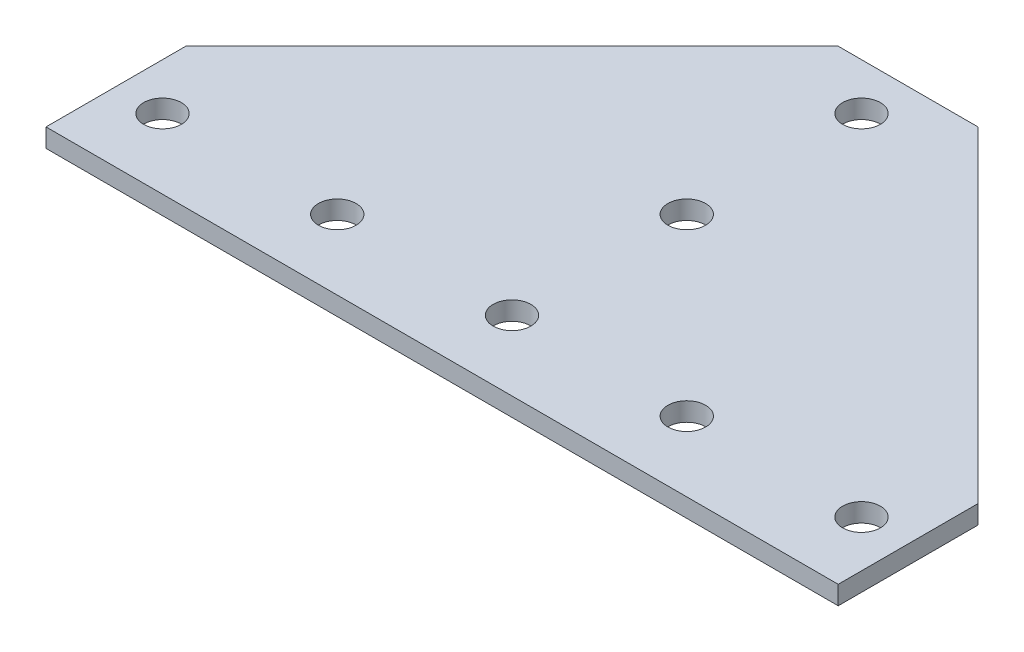
ISO-10303-21;
HEADER;
FILE_DESCRIPTION(('STEP AP214'),'2;1');
FILE_NAME('part.step','',(''),(''),'','','');
FILE_SCHEMA(('AUTOMOTIVE_DESIGN { 1 0 10303 214 1 1 1 1 }'));
ENDSEC;
DATA;
#1=APPLICATION_CONTEXT('core data for automotive mechanical design processes');
#2=APPLICATION_PROTOCOL_DEFINITION('international standard','automotive_design',2000,#1);
#3=PRODUCT_CONTEXT('',#1,'mechanical');
#4=PRODUCT('Part','Part','',(#3));
#5=PRODUCT_RELATED_PRODUCT_CATEGORY('part','',(#4));
#6=PRODUCT_DEFINITION_FORMATION('','',#4);
#7=PRODUCT_DEFINITION_CONTEXT('part definition',#1,'design');
#8=PRODUCT_DEFINITION('design','',#6,#7);
#9=PRODUCT_DEFINITION_SHAPE('','',#8);
#10=(LENGTH_UNIT() NAMED_UNIT(*) SI_UNIT(.MILLI.,.METRE.));
#11=(NAMED_UNIT(*) PLANE_ANGLE_UNIT() SI_UNIT($,.RADIAN.));
#12=(NAMED_UNIT(*) SI_UNIT($,.STERADIAN.) SOLID_ANGLE_UNIT());
#13=UNCERTAINTY_MEASURE_WITH_UNIT(LENGTH_MEASURE(1.E-05),#10,'distance_accuracy_value','');
#14=(GEOMETRIC_REPRESENTATION_CONTEXT(3) GLOBAL_UNCERTAINTY_ASSIGNED_CONTEXT((#13)) GLOBAL_UNIT_ASSIGNED_CONTEXT((#10,
#11,#12)) REPRESENTATION_CONTEXT('',''));
#15=CARTESIAN_POINT('',(0.,0.,0.));
#16=DIRECTION('',(0.,0.,1.));
#17=DIRECTION('',(1.,0.,0.));
#18=AXIS2_PLACEMENT_3D('',#15,#16,#17);
#19=CARTESIAN_POINT('',(0.,4.,0.));
#20=DIRECTION('',(0.,-1.,0.));
#21=DIRECTION('',(0.,0.,-1.));
#22=AXIS2_PLACEMENT_3D('',#19,#20,#21);
#23=PLANE('',#22);
#24=DIRECTION('',(0.,0.,-1.));
#25=VECTOR('',#24,1.);
#26=CARTESIAN_POINT('',(85.,4.,-15.));
#27=LINE('',#26,#25);
#28=CARTESIAN_POINT('',(85.,4.,15.));
#29=VERTEX_POINT('',#28);
#30=CARTESIAN_POINT('',(85.,4.,-15.));
#31=VERTEX_POINT('',#30);
#32=EDGE_CURVE('E150',#29,#31,#27,.T.);
#33=ORIENTED_EDGE('',*,*,#32,.T.);
#34=DIRECTION('',(-0.707106781186548,0.,-0.707106781186548));
#35=VECTOR('',#34,1.);
#36=CARTESIAN_POINT('',(15.,4.,-85.));
#37=LINE('',#36,#35);
#38=CARTESIAN_POINT('',(15.,4.,-85.));
#39=VERTEX_POINT('',#38);
#40=EDGE_CURVE('E98',#31,#39,#37,.T.);
#41=ORIENTED_EDGE('',*,*,#40,.T.);
#42=DIRECTION('',(-1.,0.,0.));
#43=VECTOR('',#42,1.);
#44=CARTESIAN_POINT('',(-15.,4.,-85.));
#45=LINE('',#44,#43);
#46=CARTESIAN_POINT('',(-15.,4.,-85.));
#47=VERTEX_POINT('',#46);
#48=EDGE_CURVE('E111',#39,#47,#45,.T.);
#49=ORIENTED_EDGE('',*,*,#48,.T.);
#50=DIRECTION('',(-0.707106781186548,0.,0.707106781186548));
#51=VECTOR('',#50,1.);
#52=CARTESIAN_POINT('',(-85.,4.,-15.));
#53=LINE('',#52,#51);
#54=CARTESIAN_POINT('',(-85.,4.,-15.));
#55=VERTEX_POINT('',#54);
#56=EDGE_CURVE('E105',#47,#55,#53,.T.);
#57=ORIENTED_EDGE('',*,*,#56,.T.);
#58=DIRECTION('',(0.,0.,1.));
#59=VECTOR('',#58,1.);
#60=CARTESIAN_POINT('',(-85.,4.,15.));
#61=LINE('',#60,#59);
#62=CARTESIAN_POINT('',(-85.,4.,15.));
#63=VERTEX_POINT('',#62);
#64=EDGE_CURVE('E109',#55,#63,#61,.T.);
#65=ORIENTED_EDGE('',*,*,#64,.T.);
#66=DIRECTION('',(1.,0.,0.));
#67=VECTOR('',#66,1.);
#68=CARTESIAN_POINT('',(85.,4.,15.));
#69=LINE('',#68,#67);
#70=EDGE_CURVE('E61',#63,#29,#69,.T.);
#71=ORIENTED_EDGE('',*,*,#70,.T.);
#72=EDGE_LOOP('',(#33,#41,#49,#57,#65,#71));
#73=FACE_BOUND('',#72,.T.);
#74=CARTESIAN_POINT('',(-75.,4.,0.));
#75=DIRECTION('',(0.,1.,0.));
#76=DIRECTION('',(0.,0.,1.));
#77=AXIS2_PLACEMENT_3D('',#74,#75,#76);
#78=CIRCLE('',#77,4.05);
#79=CARTESIAN_POINT('',(-75.,4.,4.05000000000001));
#80=VERTEX_POINT('',#79);
#81=EDGE_CURVE('E138',#80,#80,#78,.T.);
#82=ORIENTED_EDGE('',*,*,#81,.F.);
#83=EDGE_LOOP('',(#82));
#84=FACE_BOUND('',#83,.T.);
#85=CARTESIAN_POINT('',(-37.5,4.,0.));
#86=DIRECTION('',(0.,1.,0.));
#87=DIRECTION('',(0.,0.,1.));
#88=AXIS2_PLACEMENT_3D('',#85,#86,#87);
#89=CIRCLE('',#88,4.05000000000001);
#90=CARTESIAN_POINT('',(-37.5,4.,4.05000000000001));
#91=VERTEX_POINT('',#90);
#92=EDGE_CURVE('E258',#91,#91,#89,.T.);
#93=ORIENTED_EDGE('',*,*,#92,.F.);
#94=EDGE_LOOP('',(#93));
#95=FACE_BOUND('',#94,.T.);
#96=CARTESIAN_POINT('',(0.,4.,0.));
#97=DIRECTION('',(0.,1.,0.));
#98=DIRECTION('',(0.,0.,1.));
#99=AXIS2_PLACEMENT_3D('',#96,#97,#98);
#100=CIRCLE('',#99,4.05);
#101=CARTESIAN_POINT('',(0.,4.,4.05));
#102=VERTEX_POINT('',#101);
#103=EDGE_CURVE('E250',#102,#102,#100,.T.);
#104=ORIENTED_EDGE('',*,*,#103,.F.);
#105=EDGE_LOOP('',(#104));
#106=FACE_BOUND('',#105,.T.);
#107=CARTESIAN_POINT('',(0.,4.,-75.));
#108=DIRECTION('',(0.,1.,0.));
#109=DIRECTION('',(0.,0.,1.));
#110=AXIS2_PLACEMENT_3D('',#107,#108,#109);
#111=CIRCLE('',#110,4.04999999999999);
#112=CARTESIAN_POINT('',(0.,4.,-70.95));
#113=VERTEX_POINT('',#112);
#114=EDGE_CURVE('E242',#113,#113,#111,.T.);
#115=ORIENTED_EDGE('',*,*,#114,.F.);
#116=EDGE_LOOP('',(#115));
#117=FACE_BOUND('',#116,.T.);
#118=CARTESIAN_POINT('',(0.,4.,-37.5));
#119=DIRECTION('',(0.,1.,0.));
#120=DIRECTION('',(0.,0.,1.));
#121=AXIS2_PLACEMENT_3D('',#118,#119,#120);
#122=CIRCLE('',#121,4.04999999999999);
#123=CARTESIAN_POINT('',(0.,4.,-33.45));
#124=VERTEX_POINT('',#123);
#125=EDGE_CURVE('E234',#124,#124,#122,.T.);
#126=ORIENTED_EDGE('',*,*,#125,.F.);
#127=EDGE_LOOP('',(#126));
#128=FACE_BOUND('',#127,.T.);
#129=CARTESIAN_POINT('',(75.,4.,0.));
#130=DIRECTION('',(0.,1.,0.));
#131=DIRECTION('',(0.,0.,1.));
#132=AXIS2_PLACEMENT_3D('',#129,#130,#131);
#133=CIRCLE('',#132,4.05);
#134=CARTESIAN_POINT('',(75.,4.,4.05));
#135=VERTEX_POINT('',#134);
#136=EDGE_CURVE('E226',#135,#135,#133,.T.);
#137=ORIENTED_EDGE('',*,*,#136,.F.);
#138=EDGE_LOOP('',(#137));
#139=FACE_BOUND('',#138,.T.);
#140=CARTESIAN_POINT('',(37.5,4.,0.));
#141=DIRECTION('',(0.,1.,0.));
#142=DIRECTION('',(0.,0.,1.));
#143=AXIS2_PLACEMENT_3D('',#140,#141,#142);
#144=CIRCLE('',#143,4.05);
#145=CARTESIAN_POINT('',(37.5,4.,4.05));
#146=VERTEX_POINT('',#145);
#147=EDGE_CURVE('E215',#146,#146,#144,.T.);
#148=ORIENTED_EDGE('',*,*,#147,.F.);
#149=EDGE_LOOP('',(#148));
#150=FACE_BOUND('',#149,.T.);
#151=ADVANCED_FACE('F43',(#73,#84,#95,#106,#117,#128,#139,#150),#23,.F.);
#152=CARTESIAN_POINT('',(0.,0.,0.));
#153=DIRECTION('',(0.,-1.,0.));
#154=DIRECTION('',(0.,0.,-1.));
#155=AXIS2_PLACEMENT_3D('',#152,#153,#154);
#156=PLANE('',#155);
#157=CARTESIAN_POINT('',(75.,0.,0.));
#158=DIRECTION('',(0.,1.,0.));
#159=DIRECTION('',(0.,0.,1.));
#160=AXIS2_PLACEMENT_3D('',#157,#158,#159);
#161=CIRCLE('',#160,4.05);
#162=CARTESIAN_POINT('',(75.,0.,4.05));
#163=VERTEX_POINT('',#162);
#164=EDGE_CURVE('E223',#163,#163,#161,.T.);
#165=ORIENTED_EDGE('',*,*,#164,.T.);
#166=EDGE_LOOP('',(#165));
#167=FACE_BOUND('',#166,.T.);
#168=CARTESIAN_POINT('',(0.,0.,-75.));
#169=DIRECTION('',(0.,1.,0.));
#170=DIRECTION('',(0.,0.,1.));
#171=AXIS2_PLACEMENT_3D('',#168,#169,#170);
#172=CIRCLE('',#171,4.04999999999999);
#173=CARTESIAN_POINT('',(0.,0.,-70.95));
#174=VERTEX_POINT('',#173);
#175=EDGE_CURVE('E238',#174,#174,#172,.T.);
#176=ORIENTED_EDGE('',*,*,#175,.T.);
#177=EDGE_LOOP('',(#176));
#178=FACE_BOUND('',#177,.T.);
#179=CARTESIAN_POINT('',(-37.5,0.,0.));
#180=DIRECTION('',(0.,1.,0.));
#181=DIRECTION('',(0.,0.,1.));
#182=AXIS2_PLACEMENT_3D('',#179,#180,#181);
#183=CIRCLE('',#182,4.05000000000001);
#184=CARTESIAN_POINT('',(-37.5,0.,4.05000000000001));
#185=VERTEX_POINT('',#184);
#186=EDGE_CURVE('E254',#185,#185,#183,.T.);
#187=ORIENTED_EDGE('',*,*,#186,.T.);
#188=EDGE_LOOP('',(#187));
#189=FACE_BOUND('',#188,.T.);
#190=DIRECTION('',(0.,0.,-1.));
#191=VECTOR('',#190,1.);
#192=CARTESIAN_POINT('',(85.,0.,-15.));
#193=LINE('',#192,#191);
#194=CARTESIAN_POINT('',(85.,0.,15.));
#195=VERTEX_POINT('',#194);
#196=CARTESIAN_POINT('',(85.,0.,-15.));
#197=VERTEX_POINT('',#196);
#198=EDGE_CURVE('E133',#195,#197,#193,.T.);
#199=ORIENTED_EDGE('',*,*,#198,.F.);
#200=DIRECTION('',(1.,0.,0.));
#201=VECTOR('',#200,1.);
#202=CARTESIAN_POINT('',(85.,0.,15.));
#203=LINE('',#202,#201);
#204=CARTESIAN_POINT('',(-85.,0.,15.));
#205=VERTEX_POINT('',#204);
#206=EDGE_CURVE('E90',#205,#195,#203,.T.);
#207=ORIENTED_EDGE('',*,*,#206,.F.);
#208=DIRECTION('',(0.,0.,1.));
#209=VECTOR('',#208,1.);
#210=CARTESIAN_POINT('',(-85.,0.,15.));
#211=LINE('',#210,#209);
#212=CARTESIAN_POINT('',(-85.,0.,-15.));
#213=VERTEX_POINT('',#212);
#214=EDGE_CURVE('E84',#213,#205,#211,.T.);
#215=ORIENTED_EDGE('',*,*,#214,.F.);
#216=DIRECTION('',(-0.707106781186548,0.,0.707106781186548));
#217=VECTOR('',#216,1.);
#218=CARTESIAN_POINT('',(-85.,0.,-15.));
#219=LINE('',#218,#217);
#220=CARTESIAN_POINT('',(-15.,0.,-85.));
#221=VERTEX_POINT('',#220);
#222=EDGE_CURVE('E120',#221,#213,#219,.T.);
#223=ORIENTED_EDGE('',*,*,#222,.F.);
#224=DIRECTION('',(-1.,0.,0.));
#225=VECTOR('',#224,1.);
#226=CARTESIAN_POINT('',(-15.,0.,-85.));
#227=LINE('',#226,#225);
#228=CARTESIAN_POINT('',(15.,0.,-85.));
#229=VERTEX_POINT('',#228);
#230=EDGE_CURVE('E141',#229,#221,#227,.T.);
#231=ORIENTED_EDGE('',*,*,#230,.F.);
#232=DIRECTION('',(-0.707106781186548,0.,-0.707106781186548));
#233=VECTOR('',#232,1.);
#234=CARTESIAN_POINT('',(15.,0.,-85.));
#235=LINE('',#234,#233);
#236=EDGE_CURVE('E137',#197,#229,#235,.T.);
#237=ORIENTED_EDGE('',*,*,#236,.F.);
#238=EDGE_LOOP('',(#199,#207,#215,#223,#231,#237));
#239=FACE_BOUND('',#238,.T.);
#240=CARTESIAN_POINT('',(-75.,0.,0.));
#241=DIRECTION('',(0.,1.,0.));
#242=DIRECTION('',(0.,0.,1.));
#243=AXIS2_PLACEMENT_3D('',#240,#241,#242);
#244=CIRCLE('',#243,4.05);
#245=CARTESIAN_POINT('',(-75.,0.,4.05000000000001));
#246=VERTEX_POINT('',#245);
#247=EDGE_CURVE('E262',#246,#246,#244,.T.);
#248=ORIENTED_EDGE('',*,*,#247,.T.);
#249=EDGE_LOOP('',(#248));
#250=FACE_BOUND('',#249,.T.);
#251=CARTESIAN_POINT('',(0.,0.,0.));
#252=DIRECTION('',(0.,1.,0.));
#253=DIRECTION('',(0.,0.,1.));
#254=AXIS2_PLACEMENT_3D('',#251,#252,#253);
#255=CIRCLE('',#254,4.05);
#256=CARTESIAN_POINT('',(0.,0.,4.05));
#257=VERTEX_POINT('',#256);
#258=EDGE_CURVE('E246',#257,#257,#255,.T.);
#259=ORIENTED_EDGE('',*,*,#258,.T.);
#260=EDGE_LOOP('',(#259));
#261=FACE_BOUND('',#260,.T.);
#262=CARTESIAN_POINT('',(0.,0.,-37.5));
#263=DIRECTION('',(0.,1.,0.));
#264=DIRECTION('',(0.,0.,1.));
#265=AXIS2_PLACEMENT_3D('',#262,#263,#264);
#266=CIRCLE('',#265,4.04999999999999);
#267=CARTESIAN_POINT('',(0.,0.,-33.45));
#268=VERTEX_POINT('',#267);
#269=EDGE_CURVE('E230',#268,#268,#266,.T.);
#270=ORIENTED_EDGE('',*,*,#269,.T.);
#271=EDGE_LOOP('',(#270));
#272=FACE_BOUND('',#271,.T.);
#273=CARTESIAN_POINT('',(37.5,0.,0.));
#274=DIRECTION('',(0.,1.,0.));
#275=DIRECTION('',(0.,0.,1.));
#276=AXIS2_PLACEMENT_3D('',#273,#274,#275);
#277=CIRCLE('',#276,4.05);
#278=CARTESIAN_POINT('',(37.5,0.,4.05));
#279=VERTEX_POINT('',#278);
#280=EDGE_CURVE('E218',#279,#279,#277,.T.);
#281=ORIENTED_EDGE('',*,*,#280,.T.);
#282=EDGE_LOOP('',(#281));
#283=FACE_BOUND('',#282,.T.);
#284=ADVANCED_FACE('F163',(#167,#178,#189,#239,#250,#261,#272,#283),#156,.T.);
#285=CARTESIAN_POINT('',(85.,4.,-15.));
#286=DIRECTION('',(-1.,0.,0.));
#287=DIRECTION('',(0.,0.,1.));
#288=AXIS2_PLACEMENT_3D('',#285,#286,#287);
#289=PLANE('',#288);
#290=ORIENTED_EDGE('',*,*,#198,.T.);
#291=DIRECTION('',(0.,-1.,0.));
#292=VECTOR('',#291,1.);
#293=CARTESIAN_POINT('',(85.,4.,-15.));
#294=LINE('',#293,#292);
#295=EDGE_CURVE('E11',#31,#197,#294,.T.);
#296=ORIENTED_EDGE('',*,*,#295,.F.);
#297=ORIENTED_EDGE('',*,*,#32,.F.);
#298=DIRECTION('',(0.,-1.,0.));
#299=VECTOR('',#298,1.);
#300=CARTESIAN_POINT('',(85.,4.,15.));
#301=LINE('',#300,#299);
#302=EDGE_CURVE('E129',#29,#195,#301,.T.);
#303=ORIENTED_EDGE('',*,*,#302,.T.);
#304=EDGE_LOOP('',(#290,#296,#297,#303));
#305=FACE_BOUND('',#304,.T.);
#306=ADVANCED_FACE('F45',(#305),#289,.F.);
#307=CARTESIAN_POINT('',(15.,4.,-85.));
#308=DIRECTION('',(-0.707106781186547,0.,0.707106781186547));
#309=DIRECTION('',(0.707106781186548,0.,0.707106781186548));
#310=AXIS2_PLACEMENT_3D('',#307,#308,#309);
#311=PLANE('',#310);
#312=ORIENTED_EDGE('',*,*,#236,.T.);
#313=DIRECTION('',(0.,-1.,0.));
#314=VECTOR('',#313,1.);
#315=CARTESIAN_POINT('',(15.,4.,-85.));
#316=LINE('',#315,#314);
#317=EDGE_CURVE('E53',#39,#229,#316,.T.);
#318=ORIENTED_EDGE('',*,*,#317,.F.);
#319=ORIENTED_EDGE('',*,*,#40,.F.);
#320=ORIENTED_EDGE('',*,*,#295,.T.);
#321=EDGE_LOOP('',(#312,#318,#319,#320));
#322=FACE_BOUND('',#321,.T.);
#323=ADVANCED_FACE('F359',(#322),#311,.F.);
#324=CARTESIAN_POINT('',(-15.,4.,-85.));
#325=DIRECTION('',(0.,0.,1.));
#326=DIRECTION('',(1.,0.,0.));
#327=AXIS2_PLACEMENT_3D('',#324,#325,#326);
#328=PLANE('',#327);
#329=ORIENTED_EDGE('',*,*,#230,.T.);
#330=DIRECTION('',(0.,-1.,0.));
#331=VECTOR('',#330,1.);
#332=CARTESIAN_POINT('',(-15.,4.,-85.));
#333=LINE('',#332,#331);
#334=EDGE_CURVE('E122',#47,#221,#333,.T.);
#335=ORIENTED_EDGE('',*,*,#334,.F.);
#336=ORIENTED_EDGE('',*,*,#48,.F.);
#337=ORIENTED_EDGE('',*,*,#317,.T.);
#338=EDGE_LOOP('',(#329,#335,#336,#337));
#339=FACE_BOUND('',#338,.T.);
#340=ADVANCED_FACE('F160',(#339),#328,.F.);
#341=CARTESIAN_POINT('',(-85.,4.,-15.));
#342=DIRECTION('',(0.707106781186548,0.,0.707106781186547));
#343=DIRECTION('',(0.707106781186547,0.,-0.707106781186548));
#344=AXIS2_PLACEMENT_3D('',#341,#342,#343);
#345=PLANE('',#344);
#346=ORIENTED_EDGE('',*,*,#222,.T.);
#347=DIRECTION('',(0.,-1.,0.));
#348=VECTOR('',#347,1.);
#349=CARTESIAN_POINT('',(-85.,4.,-15.));
#350=LINE('',#349,#348);
#351=EDGE_CURVE('E117',#55,#213,#350,.T.);
#352=ORIENTED_EDGE('',*,*,#351,.F.);
#353=ORIENTED_EDGE('',*,*,#56,.F.);
#354=ORIENTED_EDGE('',*,*,#334,.T.);
#355=EDGE_LOOP('',(#346,#352,#353,#354));
#356=FACE_BOUND('',#355,.T.);
#357=ADVANCED_FACE('F118',(#356),#345,.F.);
#358=CARTESIAN_POINT('',(-85.,4.,15.));
#359=DIRECTION('',(1.,0.,0.));
#360=DIRECTION('',(0.,0.,-1.));
#361=AXIS2_PLACEMENT_3D('',#358,#359,#360);
#362=PLANE('',#361);
#363=ORIENTED_EDGE('',*,*,#214,.T.);
#364=DIRECTION('',(0.,-1.,0.));
#365=VECTOR('',#364,1.);
#366=CARTESIAN_POINT('',(-85.,4.,15.));
#367=LINE('',#366,#365);
#368=EDGE_CURVE('E123',#63,#205,#367,.T.);
#369=ORIENTED_EDGE('',*,*,#368,.F.);
#370=ORIENTED_EDGE('',*,*,#64,.F.);
#371=ORIENTED_EDGE('',*,*,#351,.T.);
#372=EDGE_LOOP('',(#363,#369,#370,#371));
#373=FACE_BOUND('',#372,.T.);
#374=ADVANCED_FACE('F125',(#373),#362,.F.);
#375=CARTESIAN_POINT('',(85.,4.,15.));
#376=DIRECTION('',(0.,0.,-1.));
#377=DIRECTION('',(-1.,0.,0.));
#378=AXIS2_PLACEMENT_3D('',#375,#376,#377);
#379=PLANE('',#378);
#380=ORIENTED_EDGE('',*,*,#206,.T.);
#381=ORIENTED_EDGE('',*,*,#302,.F.);
#382=ORIENTED_EDGE('',*,*,#70,.F.);
#383=ORIENTED_EDGE('',*,*,#368,.T.);
#384=EDGE_LOOP('',(#380,#381,#382,#383));
#385=FACE_BOUND('',#384,.T.);
#386=ADVANCED_FACE('F168',(#385),#379,.F.);
#387=CARTESIAN_POINT('',(-75.,4.,0.));
#388=DIRECTION('',(0.,-1.,0.));
#389=DIRECTION('',(0.,0.,-1.));
#390=AXIS2_PLACEMENT_3D('',#387,#388,#389);
#391=CYLINDRICAL_SURFACE('',#390,4.05);
#392=ORIENTED_EDGE('',*,*,#81,.T.);
#393=EDGE_LOOP('',(#392));
#394=FACE_BOUND('',#393,.T.);
#395=ORIENTED_EDGE('',*,*,#247,.F.);
#396=EDGE_LOOP('',(#395));
#397=FACE_BOUND('',#396,.T.);
#398=ADVANCED_FACE('F170',(#394,#397),#391,.F.);
#399=CARTESIAN_POINT('',(-37.5,4.,0.));
#400=DIRECTION('',(0.,-1.,0.));
#401=DIRECTION('',(0.,0.,-1.));
#402=AXIS2_PLACEMENT_3D('',#399,#400,#401);
#403=CYLINDRICAL_SURFACE('',#402,4.05000000000001);
#404=ORIENTED_EDGE('',*,*,#92,.T.);
#405=EDGE_LOOP('',(#404));
#406=FACE_BOUND('',#405,.T.);
#407=ORIENTED_EDGE('',*,*,#186,.F.);
#408=EDGE_LOOP('',(#407));
#409=FACE_BOUND('',#408,.T.);
#410=ADVANCED_FACE('F176',(#406,#409),#403,.F.);
#411=CARTESIAN_POINT('',(0.,4.,0.));
#412=DIRECTION('',(0.,-1.,0.));
#413=DIRECTION('',(0.,0.,-1.));
#414=AXIS2_PLACEMENT_3D('',#411,#412,#413);
#415=CYLINDRICAL_SURFACE('',#414,4.05);
#416=ORIENTED_EDGE('',*,*,#103,.T.);
#417=EDGE_LOOP('',(#416));
#418=FACE_BOUND('',#417,.T.);
#419=ORIENTED_EDGE('',*,*,#258,.F.);
#420=EDGE_LOOP('',(#419));
#421=FACE_BOUND('',#420,.T.);
#422=ADVANCED_FACE('F190',(#418,#421),#415,.F.);
#423=CARTESIAN_POINT('',(0.,4.,-75.));
#424=DIRECTION('',(0.,-1.,0.));
#425=DIRECTION('',(0.,0.,-1.));
#426=AXIS2_PLACEMENT_3D('',#423,#424,#425);
#427=CYLINDRICAL_SURFACE('',#426,4.04999999999999);
#428=ORIENTED_EDGE('',*,*,#114,.T.);
#429=EDGE_LOOP('',(#428));
#430=FACE_BOUND('',#429,.T.);
#431=ORIENTED_EDGE('',*,*,#175,.F.);
#432=EDGE_LOOP('',(#431));
#433=FACE_BOUND('',#432,.T.);
#434=ADVANCED_FACE('F194',(#430,#433),#427,.F.);
#435=CARTESIAN_POINT('',(0.,4.,-37.5));
#436=DIRECTION('',(0.,-1.,0.));
#437=DIRECTION('',(0.,0.,-1.));
#438=AXIS2_PLACEMENT_3D('',#435,#436,#437);
#439=CYLINDRICAL_SURFACE('',#438,4.04999999999999);
#440=ORIENTED_EDGE('',*,*,#125,.T.);
#441=EDGE_LOOP('',(#440));
#442=FACE_BOUND('',#441,.T.);
#443=ORIENTED_EDGE('',*,*,#269,.F.);
#444=EDGE_LOOP('',(#443));
#445=FACE_BOUND('',#444,.T.);
#446=ADVANCED_FACE('F198',(#442,#445),#439,.F.);
#447=CARTESIAN_POINT('',(75.,4.,0.));
#448=DIRECTION('',(0.,-1.,0.));
#449=DIRECTION('',(0.,0.,-1.));
#450=AXIS2_PLACEMENT_3D('',#447,#448,#449);
#451=CYLINDRICAL_SURFACE('',#450,4.05);
#452=ORIENTED_EDGE('',*,*,#136,.T.);
#453=EDGE_LOOP('',(#452));
#454=FACE_BOUND('',#453,.T.);
#455=ORIENTED_EDGE('',*,*,#164,.F.);
#456=EDGE_LOOP('',(#455));
#457=FACE_BOUND('',#456,.T.);
#458=ADVANCED_FACE('F202',(#454,#457),#451,.F.);
#459=CARTESIAN_POINT('',(37.5,4.,0.));
#460=DIRECTION('',(0.,-1.,0.));
#461=DIRECTION('',(0.,0.,-1.));
#462=AXIS2_PLACEMENT_3D('',#459,#460,#461);
#463=CYLINDRICAL_SURFACE('',#462,4.05);
#464=ORIENTED_EDGE('',*,*,#147,.T.);
#465=EDGE_LOOP('',(#464));
#466=FACE_BOUND('',#465,.T.);
#467=ORIENTED_EDGE('',*,*,#280,.F.);
#468=EDGE_LOOP('',(#467));
#469=FACE_BOUND('',#468,.T.);
#470=ADVANCED_FACE('F206',(#466,#469),#463,.F.);
#471=CLOSED_SHELL('',(#151,#284,#306,#323,#340,#357,#374,#386,#398,#410,#422,#434,#446,#458,#470));
#472=MANIFOLD_SOLID_BREP('B2',#471);
#473=ADVANCED_BREP_SHAPE_REPRESENTATION('',(#18,#472),#14);
#474=SHAPE_DEFINITION_REPRESENTATION(#9,#473);
ENDSEC;
END-ISO-10303-21;
